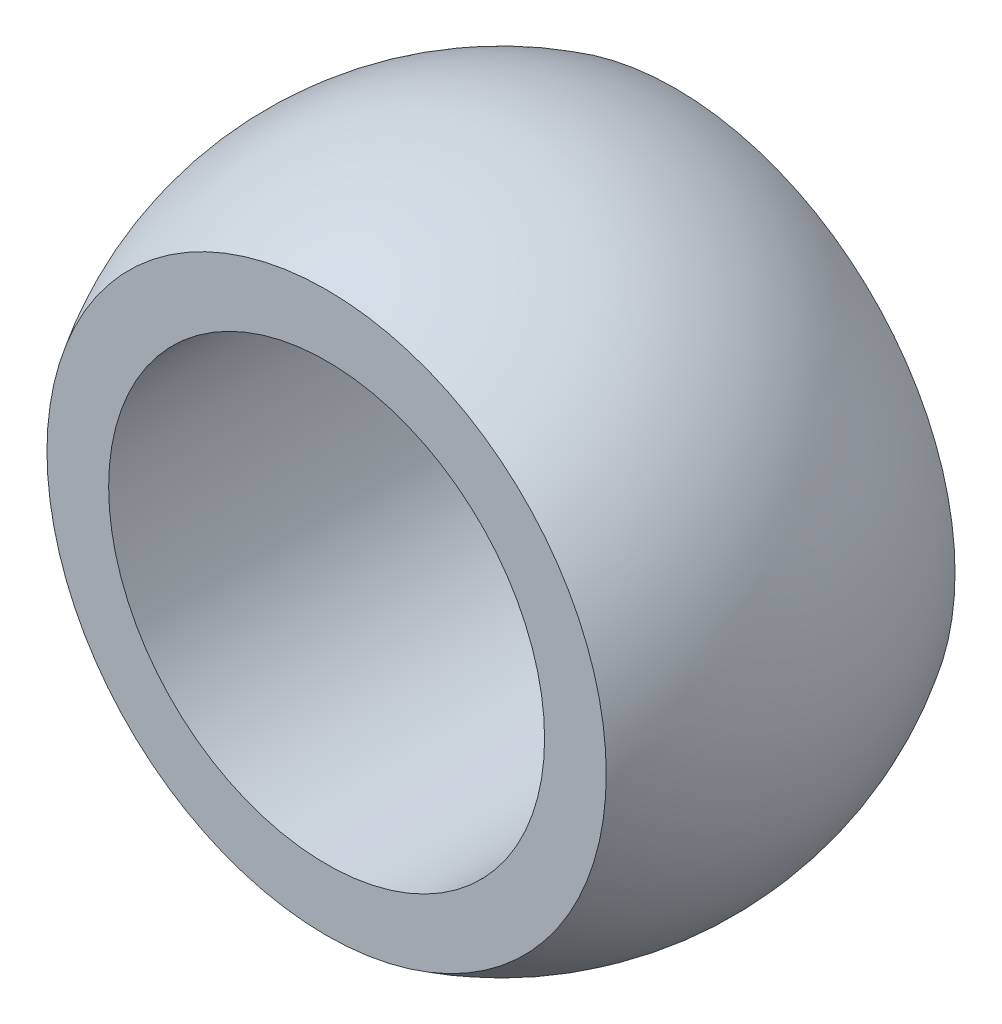
ISO-10303-21;
HEADER;
FILE_DESCRIPTION(('STEP AP214'),'2;1');
FILE_NAME('part.step','',(''),(''),'','','');
FILE_SCHEMA(('AUTOMOTIVE_DESIGN { 1 0 10303 214 1 1 1 1 }'));
ENDSEC;
DATA;
#1=APPLICATION_CONTEXT('core data for automotive mechanical design processes');
#2=APPLICATION_PROTOCOL_DEFINITION('international standard','automotive_design',2000,#1);
#3=PRODUCT_CONTEXT('',#1,'mechanical');
#4=PRODUCT('Part','Part','',(#3));
#5=PRODUCT_RELATED_PRODUCT_CATEGORY('part','',(#4));
#6=PRODUCT_DEFINITION_FORMATION('','',#4);
#7=PRODUCT_DEFINITION_CONTEXT('part definition',#1,'design');
#8=PRODUCT_DEFINITION('design','',#6,#7);
#9=PRODUCT_DEFINITION_SHAPE('','',#8);
#10=(LENGTH_UNIT() NAMED_UNIT(*) SI_UNIT(.MILLI.,.METRE.));
#11=(NAMED_UNIT(*) PLANE_ANGLE_UNIT() SI_UNIT($,.RADIAN.));
#12=(NAMED_UNIT(*) SI_UNIT($,.STERADIAN.) SOLID_ANGLE_UNIT());
#13=UNCERTAINTY_MEASURE_WITH_UNIT(LENGTH_MEASURE(1.E-05),#10,'distance_accuracy_value','');
#14=(GEOMETRIC_REPRESENTATION_CONTEXT(3) GLOBAL_UNCERTAINTY_ASSIGNED_CONTEXT((#13)) GLOBAL_UNIT_ASSIGNED_CONTEXT((#10,
#11,#12)) REPRESENTATION_CONTEXT('',''));
#15=CARTESIAN_POINT('',(0.,0.,0.));
#16=DIRECTION('',(0.,0.,1.));
#17=DIRECTION('',(1.,0.,0.));
#18=AXIS2_PLACEMENT_3D('',#15,#16,#17);
#19=CARTESIAN_POINT('',(0.,0.,0.));
#20=DIRECTION('',(0.,0.,-1.));
#21=DIRECTION('',(1.,0.,0.));
#22=AXIS2_PLACEMENT_3D('',#19,#20,#21);
#23=SPHERICAL_SURFACE('',#22,12.00023);
#24=CARTESIAN_POINT('',(0.,0.,-6.35));
#25=DIRECTION('',(0.,0.,1.));
#26=DIRECTION('',(0.,-1.,0.));
#27=AXIS2_PLACEMENT_3D('',#24,#25,#26);
#28=CIRCLE('',#27,10.1824859466095);
#29=CARTESIAN_POINT('',(10.1824859466095,0.,-6.35));
#30=VERTEX_POINT('',#29);
#31=EDGE_CURVE('E10',#30,#30,#28,.T.);
#32=CARTESIAN_POINT('',(0.,0.,6.35));
#33=DIRECTION('',(0.,0.,1.));
#34=DIRECTION('',(1.,0.,0.));
#35=AXIS2_PLACEMENT_3D('',#32,#33,#34);
#36=CIRCLE('',#35,10.1824859466095);
#37=CARTESIAN_POINT('',(10.1824859466095,0.,6.35));
#38=VERTEX_POINT('',#37);
#39=EDGE_CURVE('E36',#38,#38,#36,.T.);
#40=CARTESIAN_POINT('',(10.1824859466095,0.,-6.35));
#41=CARTESIAN_POINT('',(10.2562535184659,0.,-6.23171266817044));
#42=CARTESIAN_POINT('',(10.3279581027249,0.,-6.11213889175396));
#43=CARTESIAN_POINT('',(10.4671582474453,0.,-5.87056598629771));
#44=CARTESIAN_POINT('',(10.5346538079067,0.,-5.74856685725793));
#45=CARTESIAN_POINT('',(10.6653528564289,0.,-5.50229078310559));
#46=CARTESIAN_POINT('',(10.7285563444898,0.,-5.37801383799302));
#47=CARTESIAN_POINT('',(10.8505947816511,0.,-5.12733322370707));
#48=CARTESIAN_POINT('',(10.9094297307515,0.,-5.00092955453368));
#49=CARTESIAN_POINT('',(11.0226595617089,0.,-4.74614895541722));
#50=CARTESIAN_POINT('',(11.0770544435659,0.,-4.61777202547415));
#51=CARTESIAN_POINT('',(11.1813381022249,0.,-4.35920082115338));
#52=CARTESIAN_POINT('',(11.2312268790269,0.,-4.22900654677569));
#53=CARTESIAN_POINT('',(11.3264377357494,0.,-3.96695876176924));
#54=CARTESIAN_POINT('',(11.3717598156698,0.,-3.83510525114049));
#55=CARTESIAN_POINT('',(11.457782239781,0.,-3.56989912090442));
#56=CARTESIAN_POINT('',(11.4984825839717,0.,-3.4365465012971));
#57=CARTESIAN_POINT('',(11.5752121086423,0.,-3.16850409984416));
#58=CARTESIAN_POINT('',(11.6112412891222,0.,-3.03381431799852));
#59=CARTESIAN_POINT('',(11.6785847316826,0.,-2.76326116298669));
#60=CARTESIAN_POINT('',(11.7098989937631,0.,-2.6273977898205));
#61=CARTESIAN_POINT('',(11.7677745706227,0.,-2.35466244824756));
#62=CARTESIAN_POINT('',(11.7943358854017,0.,-2.21779047984082));
#63=CARTESIAN_POINT('',(11.8426733108984,0.,-1.94320416875268));
#64=CARTESIAN_POINT('',(11.864449421616,0.,-1.8054898260713));
#65=CARTESIAN_POINT('',(11.9031899934994,0.,-1.52938601039589));
#66=CARTESIAN_POINT('',(11.9201544546651,0.,-1.39099653740187));
#67=CARTESIAN_POINT('',(11.949251125352,0.,-1.11371052496096));
#68=CARTESIAN_POINT('',(11.9613833348731,0.,-0.974813985514056));
#69=CARTESIAN_POINT('',(11.9808007685926,0.,-0.696682519821711));
#70=CARTESIAN_POINT('',(11.988085992791,0.,-0.557447593576267));
#71=CARTESIAN_POINT('',(11.9978006084947,0.,-0.278808444887216));
#72=CARTESIAN_POINT('',(12.00023,0.,-0.139404222443609));
#73=CARTESIAN_POINT('',(12.00023,0.,0.139404222443606));
#74=CARTESIAN_POINT('',(11.9978006084947,0.,0.278808444887214));
#75=CARTESIAN_POINT('',(11.988085992791,0.,0.557447593576265));
#76=CARTESIAN_POINT('',(11.9808007685926,0.,0.696682519821709));
#77=CARTESIAN_POINT('',(11.9613833348731,0.,0.974813985514053));
#78=CARTESIAN_POINT('',(11.949251125352,0.,1.11371052496095));
#79=CARTESIAN_POINT('',(11.9201544546651,0.,1.39099653740187));
#80=CARTESIAN_POINT('',(11.9031899934994,0.,1.52938601039589));
#81=CARTESIAN_POINT('',(11.864449421616,0.,1.80548982607129));
#82=CARTESIAN_POINT('',(11.8426733108984,0.,1.94320416875268));
#83=CARTESIAN_POINT('',(11.7943358854017,0.,2.21779047984081));
#84=CARTESIAN_POINT('',(11.7677745706227,0.,2.35466244824755));
#85=CARTESIAN_POINT('',(11.7098989937631,0.,2.62739778982049));
#86=CARTESIAN_POINT('',(11.6785847316826,0.,2.76326116298669));
#87=CARTESIAN_POINT('',(11.6112412891222,0.,3.03381431799852));
#88=CARTESIAN_POINT('',(11.5752121086423,0.,3.16850409984415));
#89=CARTESIAN_POINT('',(11.4984825839717,0.,3.4365465012971));
#90=CARTESIAN_POINT('',(11.457782239781,0.,3.56989912090442));
#91=CARTESIAN_POINT('',(11.3717598156698,0.,3.83510525114049));
#92=CARTESIAN_POINT('',(11.3264377357494,0.,3.96695876176924));
#93=CARTESIAN_POINT('',(11.2312268790269,0.,4.22900654677568));
#94=CARTESIAN_POINT('',(11.1813381022249,0.,4.35920082115338));
#95=CARTESIAN_POINT('',(11.0770544435659,0.,4.61777202547415));
#96=CARTESIAN_POINT('',(11.0226595617089,0.,4.74614895541722));
#97=CARTESIAN_POINT('',(10.9094297307515,0.,5.00092955453368));
#98=CARTESIAN_POINT('',(10.8505947816511,0.,5.12733322370707));
#99=CARTESIAN_POINT('',(10.7285563444898,0.,5.37801383799302));
#100=CARTESIAN_POINT('',(10.6653528564289,0.,5.50229078310558));
#101=CARTESIAN_POINT('',(10.5346538079067,0.,5.74856685725793));
#102=CARTESIAN_POINT('',(10.4671582474453,0.,5.87056598629771));
#103=CARTESIAN_POINT('',(10.3279581027249,0.,6.11213889175396));
#104=CARTESIAN_POINT('',(10.2562535184659,0.,6.23171266817043));
#105=CARTESIAN_POINT('',(10.1824859466095,0.,6.35));
#106=B_SPLINE_CURVE_WITH_KNOTS('',3,(#40,#41,#42,#43,#44,#45,#46,#47,#48,#49,#50,#51,#52,#53,
#54,#55,#56,#57,#58,#59,#60,#61,#62,#63,#64,#65,#66,#67,#68,#69,#70,#71,#72,#73,#74,#75,#76,#77,
#78,#79,#80,#81,#82,#83,#84,#85,#86,#87,#88,#89,#90,#91,#92,#93,#94,#95,#96,#97,#98,#99,#100,
#101,#102,#103,#104,#105),.UNSPECIFIED.,.F.,.F.,(4,2,2,2,2,2,2,2,2,2,2,2,2,2,2,2,2,2,2,2,2,2,2,
2,2,2,2,2,2,2,2,2,4),(0.,0.418191506913018,0.836383013826036,1.25457452073905,1.67276602765207,
2.09095753456509,2.50914904147811,2.92734054839113,3.34553205530414,3.76372356221716,
4.18191506913018,4.6001065760432,5.01829808295621,5.43648958986923,5.85468109678225,
6.27287260369527,6.69106411060829,7.10925561752131,7.52744712443432,7.94563863134734,
8.36383013826036,8.78202164517338,9.20021315208639,9.61840465899941,10.0365961659124,
10.4547876728254,10.8729791797385,11.2911706866515,11.7093621935645,12.1275537004775,
12.5457452073905,12.9639367143036,13.3821282212166),.UNSPECIFIED.);
#107=EDGE_CURVE('BSEAM30',#30,#38,#106,.T.);
#108=ORIENTED_EDGE('',*,*,#31,.T.);
#109=ORIENTED_EDGE('',*,*,#39,.F.);
#110=ORIENTED_EDGE('',*,*,#107,.T.);
#111=ORIENTED_EDGE('',*,*,#107,.F.);
#112=EDGE_LOOP('',(#108,#110,#109,#111));
#113=FACE_BOUND('',#112,.T.);
#114=ADVANCED_FACE('F30',(#113),#23,.T.);
#115=CARTESIAN_POINT('',(-12.00023,0.,6.35));
#116=DIRECTION('',(0.,0.,1.));
#117=DIRECTION('',(1.,0.,0.));
#118=AXIS2_PLACEMENT_3D('',#115,#116,#117);
#119=PLANE('',#118);
#120=CARTESIAN_POINT('',(0.,0.,6.35));
#121=DIRECTION('',(0.,0.,1.));
#122=DIRECTION('',(1.,0.,0.));
#123=AXIS2_PLACEMENT_3D('',#120,#121,#122);
#124=CIRCLE('',#123,7.9375);
#125=CARTESIAN_POINT('',(7.9375,0.,6.35));
#126=VERTEX_POINT('',#125);
#127=EDGE_CURVE('E44',#126,#126,#124,.T.);
#128=ORIENTED_EDGE('',*,*,#127,.F.);
#129=EDGE_LOOP('',(#128));
#130=FACE_BOUND('',#129,.T.);
#131=ORIENTED_EDGE('',*,*,#39,.T.);
#132=EDGE_LOOP('',(#131));
#133=FACE_BOUND('',#132,.T.);
#134=ADVANCED_FACE('F52',(#130,#133),#119,.T.);
#135=CARTESIAN_POINT('',(-12.00023,0.,-6.35));
#136=DIRECTION('',(0.,0.,1.));
#137=DIRECTION('',(0.,-1.,0.));
#138=AXIS2_PLACEMENT_3D('',#135,#136,#137);
#139=PLANE('',#138);
#140=CARTESIAN_POINT('',(0.,0.,-6.35));
#141=DIRECTION('',(0.,0.,1.));
#142=DIRECTION('',(1.,0.,0.));
#143=AXIS2_PLACEMENT_3D('',#140,#141,#142);
#144=CIRCLE('',#143,7.9375);
#145=CARTESIAN_POINT('',(7.9375,0.,-6.35));
#146=VERTEX_POINT('',#145);
#147=EDGE_CURVE('E40',#146,#146,#144,.T.);
#148=ORIENTED_EDGE('',*,*,#147,.T.);
#149=EDGE_LOOP('',(#148));
#150=FACE_BOUND('',#149,.T.);
#151=ORIENTED_EDGE('',*,*,#31,.F.);
#152=EDGE_LOOP('',(#151));
#153=FACE_BOUND('',#152,.T.);
#154=ADVANCED_FACE('F54',(#150,#153),#139,.F.);
#155=CARTESIAN_POINT('',(0.,0.,-6.35));
#156=DIRECTION('',(0.,0.,1.));
#157=DIRECTION('',(1.,0.,0.));
#158=AXIS2_PLACEMENT_3D('',#155,#156,#157);
#159=CYLINDRICAL_SURFACE('',#158,7.9375);
#160=ORIENTED_EDGE('',*,*,#147,.F.);
#161=EDGE_LOOP('',(#160));
#162=FACE_BOUND('',#161,.T.);
#163=ORIENTED_EDGE('',*,*,#127,.T.);
#164=EDGE_LOOP('',(#163));
#165=FACE_BOUND('',#164,.T.);
#166=ADVANCED_FACE('F50',(#162,#165),#159,.F.);
#167=CLOSED_SHELL('',(#114,#134,#154,#166));
#168=MANIFOLD_SOLID_BREP('B2',#167);
#169=ADVANCED_BREP_SHAPE_REPRESENTATION('',(#18,#168),#14);
#170=SHAPE_DEFINITION_REPRESENTATION(#9,#169);
ENDSEC;
END-ISO-10303-21;
